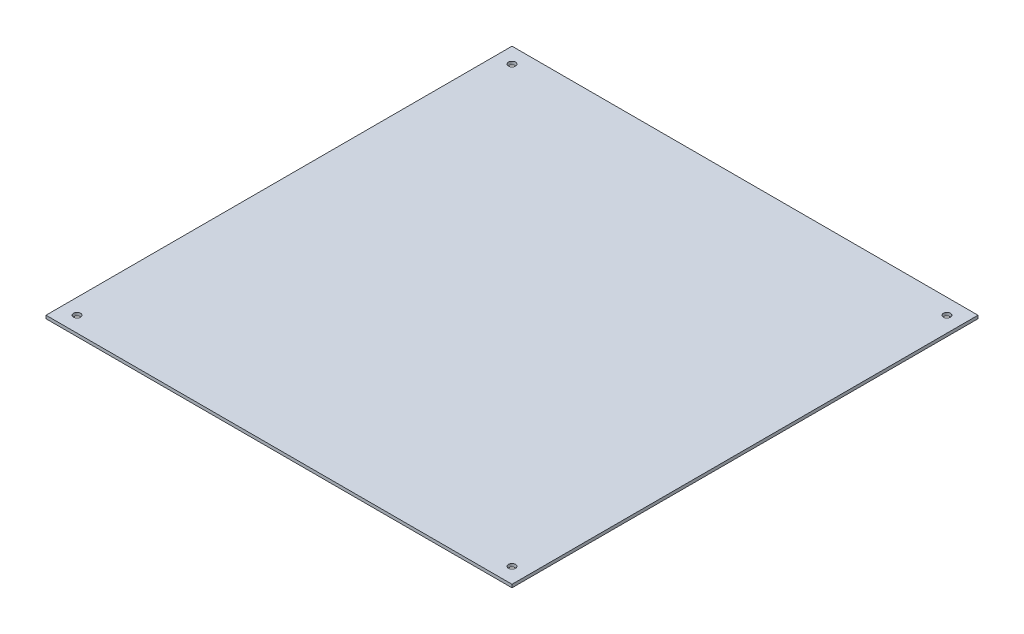
ISO-10303-21;
HEADER;
FILE_DESCRIPTION(('STEP AP214'),'2;1');
FILE_NAME('part.step','',(''),(''),'','','');
FILE_SCHEMA(('AUTOMOTIVE_DESIGN { 1 0 10303 214 1 1 1 1 }'));
ENDSEC;
DATA;
#1=APPLICATION_CONTEXT('core data for automotive mechanical design processes');
#2=APPLICATION_PROTOCOL_DEFINITION('international standard','automotive_design',2000,#1);
#3=PRODUCT_CONTEXT('',#1,'mechanical');
#4=PRODUCT('Part','Part','',(#3));
#5=PRODUCT_RELATED_PRODUCT_CATEGORY('part','',(#4));
#6=PRODUCT_DEFINITION_FORMATION('','',#4);
#7=PRODUCT_DEFINITION_CONTEXT('part definition',#1,'design');
#8=PRODUCT_DEFINITION('design','',#6,#7);
#9=PRODUCT_DEFINITION_SHAPE('','',#8);
#10=(LENGTH_UNIT() NAMED_UNIT(*) SI_UNIT(.MILLI.,.METRE.));
#11=(NAMED_UNIT(*) PLANE_ANGLE_UNIT() SI_UNIT($,.RADIAN.));
#12=(NAMED_UNIT(*) SI_UNIT($,.STERADIAN.) SOLID_ANGLE_UNIT());
#13=UNCERTAINTY_MEASURE_WITH_UNIT(LENGTH_MEASURE(1.E-05),#10,'distance_accuracy_value','');
#14=(GEOMETRIC_REPRESENTATION_CONTEXT(3) GLOBAL_UNCERTAINTY_ASSIGNED_CONTEXT((#13)) GLOBAL_UNIT_ASSIGNED_CONTEXT((#10,
#11,#12)) REPRESENTATION_CONTEXT('',''));
#15=CARTESIAN_POINT('',(0.,0.,0.));
#16=DIRECTION('',(0.,0.,1.));
#17=DIRECTION('',(1.,0.,0.));
#18=AXIS2_PLACEMENT_3D('',#15,#16,#17);
#19=CARTESIAN_POINT('',(0.,4.,0.));
#20=DIRECTION('',(1.,0.,0.));
#21=DIRECTION('',(0.,0.,-1.));
#22=AXIS2_PLACEMENT_3D('',#19,#20,#21);
#23=PLANE('',#22);
#24=DIRECTION('',(0.,0.,1.));
#25=VECTOR('',#24,1.);
#26=CARTESIAN_POINT('',(0.,0.,0.));
#27=LINE('',#26,#25);
#28=CARTESIAN_POINT('',(0.,0.,-600.));
#29=VERTEX_POINT('',#28);
#30=CARTESIAN_POINT('',(0.,0.,0.));
#31=VERTEX_POINT('',#30);
#32=EDGE_CURVE('E113',#29,#31,#27,.T.);
#33=ORIENTED_EDGE('',*,*,#32,.T.);
#34=DIRECTION('',(0.,-1.,0.));
#35=VECTOR('',#34,1.);
#36=CARTESIAN_POINT('',(0.,4.,0.));
#37=LINE('',#36,#35);
#38=CARTESIAN_POINT('',(0.,4.,0.));
#39=VERTEX_POINT('',#38);
#40=EDGE_CURVE('E11',#39,#31,#37,.T.);
#41=ORIENTED_EDGE('',*,*,#40,.F.);
#42=DIRECTION('',(0.,0.,1.));
#43=VECTOR('',#42,1.);
#44=CARTESIAN_POINT('',(0.,4.,0.));
#45=LINE('',#44,#43);
#46=CARTESIAN_POINT('',(0.,4.,-600.));
#47=VERTEX_POINT('',#46);
#48=EDGE_CURVE('E97',#47,#39,#45,.T.);
#49=ORIENTED_EDGE('',*,*,#48,.F.);
#50=DIRECTION('',(0.,-1.,0.));
#51=VECTOR('',#50,1.);
#52=CARTESIAN_POINT('',(0.,4.,-600.));
#53=LINE('',#52,#51);
#54=EDGE_CURVE('E109',#47,#29,#53,.T.);
#55=ORIENTED_EDGE('',*,*,#54,.T.);
#56=EDGE_LOOP('',(#33,#41,#49,#55));
#57=FACE_BOUND('',#56,.T.);
#58=ADVANCED_FACE('F45',(#57),#23,.F.);
#59=CARTESIAN_POINT('',(0.,4.,0.));
#60=DIRECTION('',(0.,0.,-1.));
#61=DIRECTION('',(-1.,0.,0.));
#62=AXIS2_PLACEMENT_3D('',#59,#60,#61);
#63=PLANE('',#62);
#64=DIRECTION('',(1.,0.,0.));
#65=VECTOR('',#64,1.);
#66=CARTESIAN_POINT('',(0.,0.,0.));
#67=LINE('',#66,#65);
#68=CARTESIAN_POINT('',(600.,0.,0.));
#69=VERTEX_POINT('',#68);
#70=EDGE_CURVE('E102',#31,#69,#67,.T.);
#71=ORIENTED_EDGE('',*,*,#70,.T.);
#72=DIRECTION('',(0.,-1.,0.));
#73=VECTOR('',#72,1.);
#74=CARTESIAN_POINT('',(600.,4.,0.));
#75=LINE('',#74,#73);
#76=CARTESIAN_POINT('',(600.,4.,0.));
#77=VERTEX_POINT('',#76);
#78=EDGE_CURVE('E54',#77,#69,#75,.T.);
#79=ORIENTED_EDGE('',*,*,#78,.F.);
#80=DIRECTION('',(1.,0.,0.));
#81=VECTOR('',#80,1.);
#82=CARTESIAN_POINT('',(0.,4.,0.));
#83=LINE('',#82,#81);
#84=EDGE_CURVE('E92',#39,#77,#83,.T.);
#85=ORIENTED_EDGE('',*,*,#84,.F.);
#86=ORIENTED_EDGE('',*,*,#40,.T.);
#87=EDGE_LOOP('',(#71,#79,#85,#86));
#88=FACE_BOUND('',#87,.T.);
#89=ADVANCED_FACE('F101',(#88),#63,.F.);
#90=CARTESIAN_POINT('',(600.,4.,0.));
#91=DIRECTION('',(-1.,0.,0.));
#92=DIRECTION('',(0.,0.,1.));
#93=AXIS2_PLACEMENT_3D('',#90,#91,#92);
#94=PLANE('',#93);
#95=DIRECTION('',(0.,0.,-1.));
#96=VECTOR('',#95,1.);
#97=CARTESIAN_POINT('',(600.,0.,0.));
#98=LINE('',#97,#96);
#99=CARTESIAN_POINT('',(600.,0.,-600.));
#100=VERTEX_POINT('',#99);
#101=EDGE_CURVE('E79',#69,#100,#98,.T.);
#102=ORIENTED_EDGE('',*,*,#101,.T.);
#103=DIRECTION('',(0.,-1.,0.));
#104=VECTOR('',#103,1.);
#105=CARTESIAN_POINT('',(600.,4.,-600.));
#106=LINE('',#105,#104);
#107=CARTESIAN_POINT('',(600.,4.,-600.));
#108=VERTEX_POINT('',#107);
#109=EDGE_CURVE('E104',#108,#100,#106,.T.);
#110=ORIENTED_EDGE('',*,*,#109,.F.);
#111=DIRECTION('',(0.,0.,-1.));
#112=VECTOR('',#111,1.);
#113=CARTESIAN_POINT('',(600.,4.,0.));
#114=LINE('',#113,#112);
#115=EDGE_CURVE('E95',#77,#108,#114,.T.);
#116=ORIENTED_EDGE('',*,*,#115,.F.);
#117=ORIENTED_EDGE('',*,*,#78,.T.);
#118=EDGE_LOOP('',(#102,#110,#116,#117));
#119=FACE_BOUND('',#118,.T.);
#120=ADVANCED_FACE('F105',(#119),#94,.F.);
#121=CARTESIAN_POINT('',(0.,4.,-600.));
#122=DIRECTION('',(0.,0.,1.));
#123=DIRECTION('',(1.,0.,0.));
#124=AXIS2_PLACEMENT_3D('',#121,#122,#123);
#125=PLANE('',#124);
#126=DIRECTION('',(-1.,0.,0.));
#127=VECTOR('',#126,1.);
#128=CARTESIAN_POINT('',(0.,0.,-600.));
#129=LINE('',#128,#127);
#130=EDGE_CURVE('E85',#100,#29,#129,.T.);
#131=ORIENTED_EDGE('',*,*,#130,.T.);
#132=ORIENTED_EDGE('',*,*,#54,.F.);
#133=DIRECTION('',(-1.,0.,0.));
#134=VECTOR('',#133,1.);
#135=CARTESIAN_POINT('',(0.,4.,-600.));
#136=LINE('',#135,#134);
#137=EDGE_CURVE('E62',#108,#47,#136,.T.);
#138=ORIENTED_EDGE('',*,*,#137,.F.);
#139=ORIENTED_EDGE('',*,*,#109,.T.);
#140=EDGE_LOOP('',(#131,#132,#138,#139));
#141=FACE_BOUND('',#140,.T.);
#142=ADVANCED_FACE('F127',(#141),#125,.F.);
#143=CARTESIAN_POINT('',(0.,4.,0.));
#144=DIRECTION('',(0.,-1.,0.));
#145=DIRECTION('',(0.,0.,-1.));
#146=AXIS2_PLACEMENT_3D('',#143,#144,#145);
#147=PLANE('',#146);
#148=CARTESIAN_POINT('',(20.0000000000058,4.,-19.9999999999999));
#149=DIRECTION('',(0.,1.,0.));
#150=DIRECTION('',(0.,0.,1.));
#151=AXIS2_PLACEMENT_3D('',#148,#149,#150);
#152=CIRCLE('',#151,4.5);
#153=CARTESIAN_POINT('',(20.0000000000058,4.,-15.4999999999999));
#154=VERTEX_POINT('',#153);
#155=EDGE_CURVE('E142',#154,#154,#152,.T.);
#156=ORIENTED_EDGE('',*,*,#155,.F.);
#157=EDGE_LOOP('',(#156));
#158=FACE_BOUND('',#157,.T.);
#159=CARTESIAN_POINT('',(580.000000000006,4.,-19.9999999999999));
#160=DIRECTION('',(0.,1.,0.));
#161=DIRECTION('',(0.,0.,1.));
#162=AXIS2_PLACEMENT_3D('',#159,#160,#161);
#163=CIRCLE('',#162,4.50000000000002);
#164=CARTESIAN_POINT('',(580.000000000006,4.,-15.4999999999999));
#165=VERTEX_POINT('',#164);
#166=EDGE_CURVE('E150',#165,#165,#163,.T.);
#167=ORIENTED_EDGE('',*,*,#166,.F.);
#168=EDGE_LOOP('',(#167));
#169=FACE_BOUND('',#168,.T.);
#170=CARTESIAN_POINT('',(580.,4.,-580.));
#171=DIRECTION('',(0.,1.,0.));
#172=DIRECTION('',(0.,0.,1.));
#173=AXIS2_PLACEMENT_3D('',#170,#171,#172);
#174=CIRCLE('',#173,4.50000000000002);
#175=CARTESIAN_POINT('',(580.,4.,-575.5));
#176=VERTEX_POINT('',#175);
#177=EDGE_CURVE('E158',#176,#176,#174,.T.);
#178=ORIENTED_EDGE('',*,*,#177,.F.);
#179=EDGE_LOOP('',(#178));
#180=FACE_BOUND('',#179,.T.);
#181=CARTESIAN_POINT('',(20.,4.,-580.));
#182=DIRECTION('',(0.,1.,0.));
#183=DIRECTION('',(0.,0.,1.));
#184=AXIS2_PLACEMENT_3D('',#181,#182,#183);
#185=CIRCLE('',#184,4.5);
#186=CARTESIAN_POINT('',(20.,4.,-575.5));
#187=VERTEX_POINT('',#186);
#188=EDGE_CURVE('E117',#187,#187,#185,.T.);
#189=ORIENTED_EDGE('',*,*,#188,.F.);
#190=EDGE_LOOP('',(#189));
#191=FACE_BOUND('',#190,.T.);
#192=ORIENTED_EDGE('',*,*,#48,.T.);
#193=ORIENTED_EDGE('',*,*,#84,.T.);
#194=ORIENTED_EDGE('',*,*,#115,.T.);
#195=ORIENTED_EDGE('',*,*,#137,.T.);
#196=EDGE_LOOP('',(#192,#193,#194,#195));
#197=FACE_BOUND('',#196,.T.);
#198=ADVANCED_FACE('F93',(#158,#169,#180,#191,#197),#147,.F.);
#199=CARTESIAN_POINT('',(0.,0.,0.));
#200=DIRECTION('',(0.,-1.,0.));
#201=DIRECTION('',(0.,0.,-1.));
#202=AXIS2_PLACEMENT_3D('',#199,#200,#201);
#203=PLANE('',#202);
#204=CARTESIAN_POINT('',(20.0000000000058,0.,-19.9999999999999));
#205=DIRECTION('',(0.,-1.,0.));
#206=DIRECTION('',(0.,0.,-1.));
#207=AXIS2_PLACEMENT_3D('',#204,#205,#206);
#208=CIRCLE('',#207,4.5);
#209=CARTESIAN_POINT('',(20.0000000000058,0.,-24.4999999999999));
#210=VERTEX_POINT('',#209);
#211=EDGE_CURVE('E146',#210,#210,#208,.F.);
#212=ORIENTED_EDGE('',*,*,#211,.T.);
#213=EDGE_LOOP('',(#212));
#214=FACE_BOUND('',#213,.T.);
#215=CARTESIAN_POINT('',(580.000000000006,0.,-19.9999999999999));
#216=DIRECTION('',(0.,-1.,0.));
#217=DIRECTION('',(0.,0.,-1.));
#218=AXIS2_PLACEMENT_3D('',#215,#216,#217);
#219=CIRCLE('',#218,4.50000000000002);
#220=CARTESIAN_POINT('',(580.000000000006,0.,-24.4999999999999));
#221=VERTEX_POINT('',#220);
#222=EDGE_CURVE('E154',#221,#221,#219,.F.);
#223=ORIENTED_EDGE('',*,*,#222,.T.);
#224=EDGE_LOOP('',(#223));
#225=FACE_BOUND('',#224,.T.);
#226=CARTESIAN_POINT('',(580.,0.,-580.));
#227=DIRECTION('',(0.,-1.,0.));
#228=DIRECTION('',(0.,0.,-1.));
#229=AXIS2_PLACEMENT_3D('',#226,#227,#228);
#230=CIRCLE('',#229,4.50000000000002);
#231=CARTESIAN_POINT('',(580.,0.,-584.5));
#232=VERTEX_POINT('',#231);
#233=EDGE_CURVE('E138',#232,#232,#230,.F.);
#234=ORIENTED_EDGE('',*,*,#233,.T.);
#235=EDGE_LOOP('',(#234));
#236=FACE_BOUND('',#235,.T.);
#237=CARTESIAN_POINT('',(20.,0.,-580.));
#238=DIRECTION('',(0.,-1.,0.));
#239=DIRECTION('',(0.,0.,-1.));
#240=AXIS2_PLACEMENT_3D('',#237,#238,#239);
#241=CIRCLE('',#240,4.5);
#242=CARTESIAN_POINT('',(20.,0.,-584.5));
#243=VERTEX_POINT('',#242);
#244=EDGE_CURVE('E134',#243,#243,#241,.F.);
#245=ORIENTED_EDGE('',*,*,#244,.T.);
#246=EDGE_LOOP('',(#245));
#247=FACE_BOUND('',#246,.T.);
#248=ORIENTED_EDGE('',*,*,#32,.F.);
#249=ORIENTED_EDGE('',*,*,#130,.F.);
#250=ORIENTED_EDGE('',*,*,#101,.F.);
#251=ORIENTED_EDGE('',*,*,#70,.F.);
#252=EDGE_LOOP('',(#248,#249,#250,#251));
#253=FACE_BOUND('',#252,.T.);
#254=ADVANCED_FACE('F130',(#214,#225,#236,#247,#253),#203,.T.);
#255=CARTESIAN_POINT('',(20.,-0.00100000000000013,-580.));
#256=DIRECTION('',(0.,1.,0.));
#257=DIRECTION('',(0.,0.,1.));
#258=AXIS2_PLACEMENT_3D('',#255,#256,#257);
#259=CYLINDRICAL_SURFACE('',#258,4.5);
#260=ORIENTED_EDGE('',*,*,#244,.F.);
#261=EDGE_LOOP('',(#260));
#262=FACE_BOUND('',#261,.T.);
#263=ORIENTED_EDGE('',*,*,#188,.T.);
#264=EDGE_LOOP('',(#263));
#265=FACE_BOUND('',#264,.T.);
#266=ADVANCED_FACE('F172',(#262,#265),#259,.F.);
#267=CARTESIAN_POINT('',(580.,-0.00100000000000013,-580.));
#268=DIRECTION('',(0.,1.,0.));
#269=DIRECTION('',(0.,0.,1.));
#270=AXIS2_PLACEMENT_3D('',#267,#268,#269);
#271=CYLINDRICAL_SURFACE('',#270,4.50000000000002);
#272=ORIENTED_EDGE('',*,*,#233,.F.);
#273=EDGE_LOOP('',(#272));
#274=FACE_BOUND('',#273,.T.);
#275=ORIENTED_EDGE('',*,*,#177,.T.);
#276=EDGE_LOOP('',(#275));
#277=FACE_BOUND('',#276,.T.);
#278=ADVANCED_FACE('F168',(#274,#277),#271,.F.);
#279=CARTESIAN_POINT('',(580.000000000006,-0.00100000000000013,-19.9999999999999));
#280=DIRECTION('',(0.,1.,0.));
#281=DIRECTION('',(0.,0.,1.));
#282=AXIS2_PLACEMENT_3D('',#279,#280,#281);
#283=CYLINDRICAL_SURFACE('',#282,4.50000000000002);
#284=ORIENTED_EDGE('',*,*,#222,.F.);
#285=EDGE_LOOP('',(#284));
#286=FACE_BOUND('',#285,.T.);
#287=ORIENTED_EDGE('',*,*,#166,.T.);
#288=EDGE_LOOP('',(#287));
#289=FACE_BOUND('',#288,.T.);
#290=ADVANCED_FACE('F171',(#286,#289),#283,.F.);
#291=CARTESIAN_POINT('',(20.0000000000058,-0.00100000000000013,-19.9999999999999));
#292=DIRECTION('',(0.,1.,0.));
#293=DIRECTION('',(0.,0.,1.));
#294=AXIS2_PLACEMENT_3D('',#291,#292,#293);
#295=CYLINDRICAL_SURFACE('',#294,4.5);
#296=ORIENTED_EDGE('',*,*,#211,.F.);
#297=EDGE_LOOP('',(#296));
#298=FACE_BOUND('',#297,.T.);
#299=ORIENTED_EDGE('',*,*,#155,.T.);
#300=EDGE_LOOP('',(#299));
#301=FACE_BOUND('',#300,.T.);
#302=ADVANCED_FACE('F236',(#298,#301),#295,.F.);
#303=CLOSED_SHELL('',(#58,#89,#120,#142,#198,#254,#266,#278,#290,#302));
#304=MANIFOLD_SOLID_BREP('B2',#303);
#305=ADVANCED_BREP_SHAPE_REPRESENTATION('',(#18,#304),#14);
#306=SHAPE_DEFINITION_REPRESENTATION(#9,#305);
ENDSEC;
END-ISO-10303-21;
